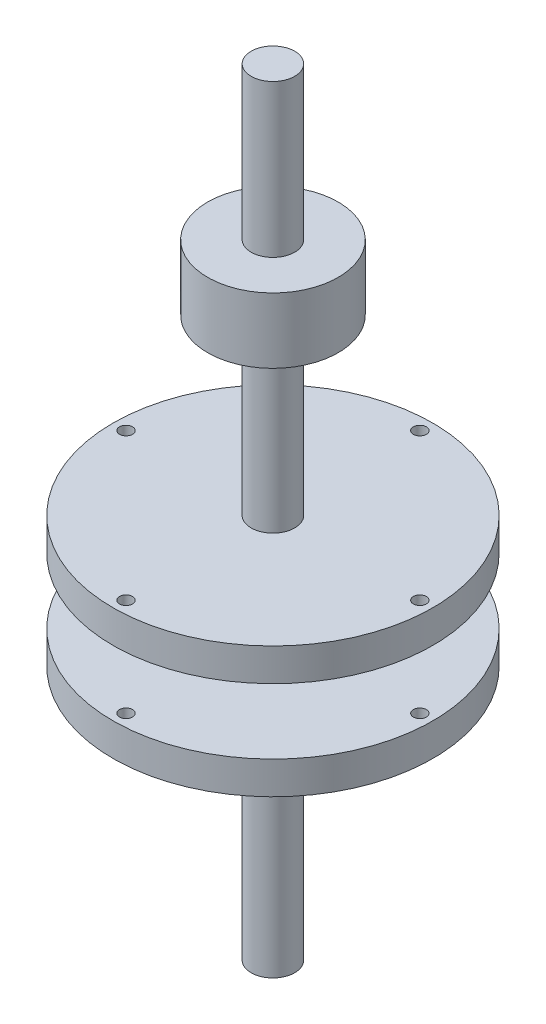
ISO-10303-21;
HEADER;
FILE_DESCRIPTION(('STEP AP214'),'2;1');
FILE_NAME('part.step','',(''),(''),'','','');
FILE_SCHEMA(('AUTOMOTIVE_DESIGN { 1 0 10303 214 1 1 1 1 }'));
ENDSEC;
DATA;
#1=APPLICATION_CONTEXT('core data for automotive mechanical design processes');
#2=APPLICATION_PROTOCOL_DEFINITION('international standard','automotive_design',2000,#1);
#3=PRODUCT_CONTEXT('',#1,'mechanical');
#4=PRODUCT('Part','Part','',(#3));
#5=PRODUCT_RELATED_PRODUCT_CATEGORY('part','',(#4));
#6=PRODUCT_DEFINITION_FORMATION('','',#4);
#7=PRODUCT_DEFINITION_CONTEXT('part definition',#1,'design');
#8=PRODUCT_DEFINITION('design','',#6,#7);
#9=PRODUCT_DEFINITION_SHAPE('','',#8);
#10=(LENGTH_UNIT() NAMED_UNIT(*) SI_UNIT(.MILLI.,.METRE.));
#11=(NAMED_UNIT(*) PLANE_ANGLE_UNIT() SI_UNIT($,.RADIAN.));
#12=(NAMED_UNIT(*) SI_UNIT($,.STERADIAN.) SOLID_ANGLE_UNIT());
#13=UNCERTAINTY_MEASURE_WITH_UNIT(LENGTH_MEASURE(1.E-05),#10,'distance_accuracy_value','');
#14=(GEOMETRIC_REPRESENTATION_CONTEXT(3) GLOBAL_UNCERTAINTY_ASSIGNED_CONTEXT((#13)) GLOBAL_UNIT_ASSIGNED_CONTEXT((#10,
#11,#12)) REPRESENTATION_CONTEXT('',''));
#15=CARTESIAN_POINT('',(0.,0.,0.));
#16=DIRECTION('',(0.,0.,1.));
#17=DIRECTION('',(1.,0.,0.));
#18=AXIS2_PLACEMENT_3D('',#15,#16,#17);
#19=CARTESIAN_POINT('',(0.,223.956756343832,0.));
#20=DIRECTION('',(0.,1.,0.));
#21=DIRECTION('',(-1.,0.,0.));
#22=AXIS2_PLACEMENT_3D('',#19,#20,#21);
#23=CYLINDRICAL_SURFACE('',#22,9.99999999999999);
#24=CARTESIAN_POINT('',(0.,-61.35475,0.));
#25=DIRECTION('',(0.,1.,0.));
#26=DIRECTION('',(-1.,0.,0.));
#27=AXIS2_PLACEMENT_3D('',#24,#25,#26);
#28=CIRCLE('',#27,9.99999999999999);
#29=CARTESIAN_POINT('',(-9.99999999999998,-61.35475,0.));
#30=VERTEX_POINT('',#29);
#31=EDGE_CURVE('E10',#30,#30,#28,.T.);
#32=ORIENTED_EDGE('',*,*,#31,.F.);
#33=EDGE_LOOP('',(#32));
#34=FACE_BOUND('',#33,.T.);
#35=CARTESIAN_POINT('',(0.,-178.35475,0.));
#36=DIRECTION('',(0.,1.,0.));
#37=DIRECTION('',(-1.,0.,0.));
#38=AXIS2_PLACEMENT_3D('',#35,#36,#37);
#39=CIRCLE('',#38,9.99999999999999);
#40=CARTESIAN_POINT('',(-9.99999999999999,-178.35475,0.));
#41=VERTEX_POINT('',#40);
#42=EDGE_CURVE('E100',#41,#41,#39,.T.);
#43=ORIENTED_EDGE('',*,*,#42,.T.);
#44=EDGE_LOOP('',(#43));
#45=FACE_BOUND('',#44,.T.);
#46=ADVANCED_FACE('F39',(#34,#45),#23,.T.);
#47=CARTESIAN_POINT('',(0.,-61.35475,0.));
#48=DIRECTION('',(0.,1.,0.));
#49=DIRECTION('',(-1.,0.,0.));
#50=AXIS2_PLACEMENT_3D('',#47,#48,#49);
#51=PLANE('',#50);
#52=CARTESIAN_POINT('',(67.5,-61.35475,0.));
#53=DIRECTION('',(0.,-1.,0.));
#54=DIRECTION('',(1.,0.,0.));
#55=AXIS2_PLACEMENT_3D('',#52,#53,#54);
#56=CIRCLE('',#55,3.00000000000001);
#57=CARTESIAN_POINT('',(70.5,-61.35475,0.));
#58=VERTEX_POINT('',#57);
#59=EDGE_CURVE('E62',#58,#58,#56,.T.);
#60=ORIENTED_EDGE('',*,*,#59,.F.);
#61=EDGE_LOOP('',(#60));
#62=FACE_BOUND('',#61,.T.);
#63=CARTESIAN_POINT('',(-67.5,-61.35475,0.));
#64=DIRECTION('',(0.,-1.,0.));
#65=DIRECTION('',(1.,0.,0.));
#66=AXIS2_PLACEMENT_3D('',#63,#64,#65);
#67=CIRCLE('',#66,3.00000000000001);
#68=CARTESIAN_POINT('',(-64.5,-61.35475,0.));
#69=VERTEX_POINT('',#68);
#70=EDGE_CURVE('E412',#69,#69,#67,.T.);
#71=ORIENTED_EDGE('',*,*,#70,.F.);
#72=EDGE_LOOP('',(#71));
#73=FACE_BOUND('',#72,.T.);
#74=CARTESIAN_POINT('',(0.,-61.35475,67.5));
#75=DIRECTION('',(0.,-1.,0.));
#76=DIRECTION('',(1.,0.,0.));
#77=AXIS2_PLACEMENT_3D('',#74,#75,#76);
#78=CIRCLE('',#77,3.);
#79=CARTESIAN_POINT('',(3.,-61.35475,67.5));
#80=VERTEX_POINT('',#79);
#81=EDGE_CURVE('E408',#80,#80,#78,.T.);
#82=ORIENTED_EDGE('',*,*,#81,.F.);
#83=EDGE_LOOP('',(#82));
#84=FACE_BOUND('',#83,.T.);
#85=CARTESIAN_POINT('',(0.,-61.35475,-67.5));
#86=DIRECTION('',(0.,-1.,0.));
#87=DIRECTION('',(1.,0.,0.));
#88=AXIS2_PLACEMENT_3D('',#85,#86,#87);
#89=CIRCLE('',#88,3.);
#90=CARTESIAN_POINT('',(3.00000000000001,-61.35475,-67.5));
#91=VERTEX_POINT('',#90);
#92=EDGE_CURVE('E404',#91,#91,#89,.T.);
#93=ORIENTED_EDGE('',*,*,#92,.F.);
#94=EDGE_LOOP('',(#93));
#95=FACE_BOUND('',#94,.T.);
#96=CARTESIAN_POINT('',(0.,-61.3547499999999,0.));
#97=DIRECTION('',(0.,1.,0.));
#98=DIRECTION('',(-1.,0.,0.));
#99=AXIS2_PLACEMENT_3D('',#96,#97,#98);
#100=CIRCLE('',#99,73.5000000000001);
#101=CARTESIAN_POINT('',(-73.5,-61.3547499999999,0.));
#102=VERTEX_POINT('',#101);
#103=EDGE_CURVE('E47',#102,#102,#100,.T.);
#104=ORIENTED_EDGE('',*,*,#103,.F.);
#105=EDGE_LOOP('',(#104));
#106=FACE_BOUND('',#105,.T.);
#107=ORIENTED_EDGE('',*,*,#31,.T.);
#108=EDGE_LOOP('',(#107));
#109=FACE_BOUND('',#108,.T.);
#110=ADVANCED_FACE('F151',(#62,#73,#84,#95,#106,#109),#51,.F.);
#111=CARTESIAN_POINT('',(0.,223.956756343832,0.));
#112=DIRECTION('',(0.,1.,0.));
#113=DIRECTION('',(-1.,0.,0.));
#114=AXIS2_PLACEMENT_3D('',#111,#112,#113);
#115=CYLINDRICAL_SURFACE('',#114,73.5);
#116=ORIENTED_EDGE('',*,*,#103,.T.);
#117=EDGE_LOOP('',(#116));
#118=FACE_BOUND('',#117,.T.);
#119=CARTESIAN_POINT('',(0.,-46.35475,0.));
#120=DIRECTION('',(0.,1.,0.));
#121=DIRECTION('',(-1.,0.,0.));
#122=AXIS2_PLACEMENT_3D('',#119,#120,#121);
#123=CIRCLE('',#122,73.5);
#124=CARTESIAN_POINT('',(-73.5,-46.35475,0.));
#125=VERTEX_POINT('',#124);
#126=EDGE_CURVE('E53',#125,#125,#123,.T.);
#127=ORIENTED_EDGE('',*,*,#126,.F.);
#128=EDGE_LOOP('',(#127));
#129=FACE_BOUND('',#128,.T.);
#130=ADVANCED_FACE('F149',(#118,#129),#115,.T.);
#131=CARTESIAN_POINT('',(0.,-46.35475,0.));
#132=DIRECTION('',(0.,-1.,0.));
#133=DIRECTION('',(1.,0.,0.));
#134=AXIS2_PLACEMENT_3D('',#131,#132,#133);
#135=PLANE('',#134);
#136=CARTESIAN_POINT('',(67.5,-46.35475,0.));
#137=DIRECTION('',(0.,-1.,0.));
#138=DIRECTION('',(1.,0.,0.));
#139=AXIS2_PLACEMENT_3D('',#136,#137,#138);
#140=CIRCLE('',#139,3.00000000000001);
#141=CARTESIAN_POINT('',(70.5,-46.35475,0.));
#142=VERTEX_POINT('',#141);
#143=EDGE_CURVE('E96',#142,#142,#140,.T.);
#144=ORIENTED_EDGE('',*,*,#143,.T.);
#145=EDGE_LOOP('',(#144));
#146=FACE_BOUND('',#145,.T.);
#147=CARTESIAN_POINT('',(-67.5,-46.35475,0.));
#148=DIRECTION('',(0.,-1.,0.));
#149=DIRECTION('',(1.,0.,0.));
#150=AXIS2_PLACEMENT_3D('',#147,#148,#149);
#151=CIRCLE('',#150,3.00000000000001);
#152=CARTESIAN_POINT('',(-64.5,-46.35475,0.));
#153=VERTEX_POINT('',#152);
#154=EDGE_CURVE('E78',#153,#153,#151,.T.);
#155=ORIENTED_EDGE('',*,*,#154,.T.);
#156=EDGE_LOOP('',(#155));
#157=FACE_BOUND('',#156,.T.);
#158=CARTESIAN_POINT('',(0.,-46.35475,67.5));
#159=DIRECTION('',(0.,-1.,0.));
#160=DIRECTION('',(1.,0.,0.));
#161=AXIS2_PLACEMENT_3D('',#158,#159,#160);
#162=CIRCLE('',#161,3.);
#163=CARTESIAN_POINT('',(3.,-46.35475,67.5));
#164=VERTEX_POINT('',#163);
#165=EDGE_CURVE('E72',#164,#164,#162,.T.);
#166=ORIENTED_EDGE('',*,*,#165,.T.);
#167=EDGE_LOOP('',(#166));
#168=FACE_BOUND('',#167,.T.);
#169=CARTESIAN_POINT('',(0.,-46.35475,-67.5));
#170=DIRECTION('',(0.,-1.,0.));
#171=DIRECTION('',(1.,0.,0.));
#172=AXIS2_PLACEMENT_3D('',#169,#170,#171);
#173=CIRCLE('',#172,3.);
#174=CARTESIAN_POINT('',(3.00000000000001,-46.35475,-67.5));
#175=VERTEX_POINT('',#174);
#176=EDGE_CURVE('E67',#175,#175,#173,.T.);
#177=ORIENTED_EDGE('',*,*,#176,.T.);
#178=EDGE_LOOP('',(#177));
#179=FACE_BOUND('',#178,.T.);
#180=CARTESIAN_POINT('',(0.,-46.35475,0.));
#181=DIRECTION('',(0.,1.,0.));
#182=DIRECTION('',(-1.,0.,0.));
#183=AXIS2_PLACEMENT_3D('',#180,#181,#182);
#184=CIRCLE('',#183,9.99999999999999);
#185=CARTESIAN_POINT('',(-9.99999999999998,-46.35475,0.));
#186=VERTEX_POINT('',#185);
#187=EDGE_CURVE('E140',#186,#186,#184,.T.);
#188=ORIENTED_EDGE('',*,*,#187,.F.);
#189=EDGE_LOOP('',(#188));
#190=FACE_BOUND('',#189,.T.);
#191=ORIENTED_EDGE('',*,*,#126,.T.);
#192=EDGE_LOOP('',(#191));
#193=FACE_BOUND('',#192,.T.);
#194=ADVANCED_FACE('F147',(#146,#157,#168,#179,#190,#193),#135,.F.);
#195=CARTESIAN_POINT('',(0.,223.956756343832,0.));
#196=DIRECTION('',(0.,1.,0.));
#197=DIRECTION('',(-1.,0.,0.));
#198=AXIS2_PLACEMENT_3D('',#195,#196,#197);
#199=CYLINDRICAL_SURFACE('',#198,9.99999999999999);
#200=CARTESIAN_POINT('',(0.,-16.35475,0.));
#201=DIRECTION('',(0.,1.,0.));
#202=DIRECTION('',(-1.,0.,0.));
#203=AXIS2_PLACEMENT_3D('',#200,#201,#202);
#204=CIRCLE('',#203,9.99999999999999);
#205=CARTESIAN_POINT('',(-9.99999999999998,-16.35475,0.));
#206=VERTEX_POINT('',#205);
#207=EDGE_CURVE('E136',#206,#206,#204,.T.);
#208=ORIENTED_EDGE('',*,*,#207,.F.);
#209=EDGE_LOOP('',(#208));
#210=FACE_BOUND('',#209,.T.);
#211=ORIENTED_EDGE('',*,*,#187,.T.);
#212=EDGE_LOOP('',(#211));
#213=FACE_BOUND('',#212,.T.);
#214=ADVANCED_FACE('F158',(#210,#213),#199,.T.);
#215=CARTESIAN_POINT('',(0.,-16.35475,0.));
#216=DIRECTION('',(0.,-1.,0.));
#217=DIRECTION('',(1.,0.,0.));
#218=AXIS2_PLACEMENT_3D('',#215,#216,#217);
#219=PLANE('',#218);
#220=CARTESIAN_POINT('',(67.5,-16.35475,0.));
#221=DIRECTION('',(0.,-1.,0.));
#222=DIRECTION('',(1.,0.,0.));
#223=AXIS2_PLACEMENT_3D('',#220,#221,#222);
#224=CIRCLE('',#223,3.00000000000001);
#225=CARTESIAN_POINT('',(70.5,-16.35475,0.));
#226=VERTEX_POINT('',#225);
#227=EDGE_CURVE('E92',#226,#226,#224,.T.);
#228=ORIENTED_EDGE('',*,*,#227,.F.);
#229=EDGE_LOOP('',(#228));
#230=FACE_BOUND('',#229,.T.);
#231=CARTESIAN_POINT('',(-67.5,-16.35475,0.));
#232=DIRECTION('',(0.,-1.,0.));
#233=DIRECTION('',(1.,0.,0.));
#234=AXIS2_PLACEMENT_3D('',#231,#232,#233);
#235=CIRCLE('',#234,3.00000000000001);
#236=CARTESIAN_POINT('',(-64.5,-16.35475,0.));
#237=VERTEX_POINT('',#236);
#238=EDGE_CURVE('E71',#237,#237,#235,.T.);
#239=ORIENTED_EDGE('',*,*,#238,.F.);
#240=EDGE_LOOP('',(#239));
#241=FACE_BOUND('',#240,.T.);
#242=CARTESIAN_POINT('',(0.,-16.35475,67.5));
#243=DIRECTION('',(0.,-1.,0.));
#244=DIRECTION('',(1.,0.,0.));
#245=AXIS2_PLACEMENT_3D('',#242,#243,#244);
#246=CIRCLE('',#245,3.);
#247=CARTESIAN_POINT('',(3.,-16.35475,67.5));
#248=VERTEX_POINT('',#247);
#249=EDGE_CURVE('E66',#248,#248,#246,.T.);
#250=ORIENTED_EDGE('',*,*,#249,.F.);
#251=EDGE_LOOP('',(#250));
#252=FACE_BOUND('',#251,.T.);
#253=CARTESIAN_POINT('',(0.,-16.35475,-67.5));
#254=DIRECTION('',(0.,-1.,0.));
#255=DIRECTION('',(1.,0.,0.));
#256=AXIS2_PLACEMENT_3D('',#253,#254,#255);
#257=CIRCLE('',#256,3.);
#258=CARTESIAN_POINT('',(3.00000000000001,-16.35475,-67.5));
#259=VERTEX_POINT('',#258);
#260=EDGE_CURVE('E61',#259,#259,#257,.T.);
#261=ORIENTED_EDGE('',*,*,#260,.F.);
#262=EDGE_LOOP('',(#261));
#263=FACE_BOUND('',#262,.T.);
#264=ORIENTED_EDGE('',*,*,#207,.T.);
#265=EDGE_LOOP('',(#264));
#266=FACE_BOUND('',#265,.T.);
#267=CARTESIAN_POINT('',(0.,-16.3547499999999,0.));
#268=DIRECTION('',(0.,1.,0.));
#269=DIRECTION('',(-1.,0.,0.));
#270=AXIS2_PLACEMENT_3D('',#267,#268,#269);
#271=CIRCLE('',#270,73.5);
#272=CARTESIAN_POINT('',(-73.5,-16.3547499999999,0.));
#273=VERTEX_POINT('',#272);
#274=EDGE_CURVE('E132',#273,#273,#271,.T.);
#275=ORIENTED_EDGE('',*,*,#274,.F.);
#276=EDGE_LOOP('',(#275));
#277=FACE_BOUND('',#276,.T.);
#278=ADVANCED_FACE('F213',(#230,#241,#252,#263,#266,#277),#219,.T.);
#279=CARTESIAN_POINT('',(0.,223.956756343832,0.));
#280=DIRECTION('',(0.,1.,0.));
#281=DIRECTION('',(-1.,0.,0.));
#282=AXIS2_PLACEMENT_3D('',#279,#280,#281);
#283=CYLINDRICAL_SURFACE('',#282,73.5);
#284=ORIENTED_EDGE('',*,*,#274,.T.);
#285=EDGE_LOOP('',(#284));
#286=FACE_BOUND('',#285,.T.);
#287=CARTESIAN_POINT('',(0.,-1.35474999999996,0.));
#288=DIRECTION('',(0.,1.,0.));
#289=DIRECTION('',(-1.,0.,0.));
#290=AXIS2_PLACEMENT_3D('',#287,#288,#289);
#291=CIRCLE('',#290,73.5);
#292=CARTESIAN_POINT('',(-73.5,-1.35474999999996,0.));
#293=VERTEX_POINT('',#292);
#294=EDGE_CURVE('E128',#293,#293,#291,.T.);
#295=ORIENTED_EDGE('',*,*,#294,.F.);
#296=EDGE_LOOP('',(#295));
#297=FACE_BOUND('',#296,.T.);
#298=ADVANCED_FACE('F209',(#286,#297),#283,.T.);
#299=CARTESIAN_POINT('',(0.,-1.35474999999997,0.));
#300=DIRECTION('',(0.,1.,0.));
#301=DIRECTION('',(-1.,0.,0.));
#302=AXIS2_PLACEMENT_3D('',#299,#300,#301);
#303=PLANE('',#302);
#304=CARTESIAN_POINT('',(67.5,-1.35474999999997,0.));
#305=DIRECTION('',(0.,1.,0.));
#306=DIRECTION('',(-1.,0.,0.));
#307=AXIS2_PLACEMENT_3D('',#304,#305,#306);
#308=CIRCLE('',#307,3.00000000000001);
#309=CARTESIAN_POINT('',(64.5,-1.35474999999997,0.));
#310=VERTEX_POINT('',#309);
#311=EDGE_CURVE('E42',#310,#310,#308,.T.);
#312=ORIENTED_EDGE('',*,*,#311,.F.);
#313=EDGE_LOOP('',(#312));
#314=FACE_BOUND('',#313,.T.);
#315=CARTESIAN_POINT('',(-67.5,-1.35474999999996,0.));
#316=DIRECTION('',(0.,1.,0.));
#317=DIRECTION('',(-1.,0.,0.));
#318=AXIS2_PLACEMENT_3D('',#315,#316,#317);
#319=CIRCLE('',#318,3.00000000000001);
#320=CARTESIAN_POINT('',(-70.5,-1.35474999999996,0.));
#321=VERTEX_POINT('',#320);
#322=EDGE_CURVE('E68',#321,#321,#319,.T.);
#323=ORIENTED_EDGE('',*,*,#322,.F.);
#324=EDGE_LOOP('',(#323));
#325=FACE_BOUND('',#324,.T.);
#326=CARTESIAN_POINT('',(0.,-1.35474999999997,67.5));
#327=DIRECTION('',(0.,1.,0.));
#328=DIRECTION('',(-1.,0.,0.));
#329=AXIS2_PLACEMENT_3D('',#326,#327,#328);
#330=CIRCLE('',#329,3.);
#331=CARTESIAN_POINT('',(-3.,-1.35474999999997,67.5));
#332=VERTEX_POINT('',#331);
#333=EDGE_CURVE('E63',#332,#332,#330,.T.);
#334=ORIENTED_EDGE('',*,*,#333,.F.);
#335=EDGE_LOOP('',(#334));
#336=FACE_BOUND('',#335,.T.);
#337=CARTESIAN_POINT('',(0.,-1.35474999999997,-67.5));
#338=DIRECTION('',(0.,1.,0.));
#339=DIRECTION('',(-1.,0.,0.));
#340=AXIS2_PLACEMENT_3D('',#337,#338,#339);
#341=CIRCLE('',#340,3.);
#342=CARTESIAN_POINT('',(-2.99999999999999,-1.35474999999997,-67.5));
#343=VERTEX_POINT('',#342);
#344=EDGE_CURVE('E57',#343,#343,#341,.T.);
#345=ORIENTED_EDGE('',*,*,#344,.F.);
#346=EDGE_LOOP('',(#345));
#347=FACE_BOUND('',#346,.T.);
#348=ORIENTED_EDGE('',*,*,#294,.T.);
#349=EDGE_LOOP('',(#348));
#350=FACE_BOUND('',#349,.T.);
#351=CARTESIAN_POINT('',(0.,-1.35474999999999,0.));
#352=DIRECTION('',(0.,1.,0.));
#353=DIRECTION('',(-1.,0.,0.));
#354=AXIS2_PLACEMENT_3D('',#351,#352,#353);
#355=CIRCLE('',#354,9.99999999999999);
#356=CARTESIAN_POINT('',(-9.99999999999998,-1.35474999999999,0.));
#357=VERTEX_POINT('',#356);
#358=EDGE_CURVE('E124',#357,#357,#355,.T.);
#359=ORIENTED_EDGE('',*,*,#358,.F.);
#360=EDGE_LOOP('',(#359));
#361=FACE_BOUND('',#360,.T.);
#362=ADVANCED_FACE('F205',(#314,#325,#336,#347,#350,#361),#303,.T.);
#363=CARTESIAN_POINT('',(0.,223.956756343832,0.));
#364=DIRECTION('',(0.,1.,0.));
#365=DIRECTION('',(-1.,0.,0.));
#366=AXIS2_PLACEMENT_3D('',#363,#364,#365);
#367=CYLINDRICAL_SURFACE('',#366,9.99999999999998);
#368=CARTESIAN_POINT('',(0.,78.35475,0.));
#369=DIRECTION('',(0.,1.,0.));
#370=DIRECTION('',(-1.,0.,0.));
#371=AXIS2_PLACEMENT_3D('',#368,#369,#370);
#372=CIRCLE('',#371,9.99999999999998);
#373=CARTESIAN_POINT('',(-9.99999999999997,78.35475,0.));
#374=VERTEX_POINT('',#373);
#375=EDGE_CURVE('E120',#374,#374,#372,.T.);
#376=ORIENTED_EDGE('',*,*,#375,.F.);
#377=EDGE_LOOP('',(#376));
#378=FACE_BOUND('',#377,.T.);
#379=ORIENTED_EDGE('',*,*,#358,.T.);
#380=EDGE_LOOP('',(#379));
#381=FACE_BOUND('',#380,.T.);
#382=ADVANCED_FACE('F201',(#378,#381),#367,.T.);
#383=CARTESIAN_POINT('',(0.,78.35475,0.));
#384=DIRECTION('',(0.,1.,0.));
#385=DIRECTION('',(-1.,0.,0.));
#386=AXIS2_PLACEMENT_3D('',#383,#384,#385);
#387=PLANE('',#386);
#388=CARTESIAN_POINT('',(0.,78.35475,0.));
#389=DIRECTION('',(0.,1.,0.));
#390=DIRECTION('',(-1.,0.,0.));
#391=AXIS2_PLACEMENT_3D('',#388,#389,#390);
#392=CIRCLE('',#391,30.);
#393=CARTESIAN_POINT('',(-30.,78.35475,0.));
#394=VERTEX_POINT('',#393);
#395=EDGE_CURVE('E116',#394,#394,#392,.T.);
#396=ORIENTED_EDGE('',*,*,#395,.F.);
#397=EDGE_LOOP('',(#396));
#398=FACE_BOUND('',#397,.T.);
#399=ORIENTED_EDGE('',*,*,#375,.T.);
#400=EDGE_LOOP('',(#399));
#401=FACE_BOUND('',#400,.T.);
#402=ADVANCED_FACE('F197',(#398,#401),#387,.F.);
#403=CARTESIAN_POINT('',(0.,223.956756343832,0.));
#404=DIRECTION('',(0.,1.,0.));
#405=DIRECTION('',(-1.,0.,0.));
#406=AXIS2_PLACEMENT_3D('',#403,#404,#405);
#407=CYLINDRICAL_SURFACE('',#406,30.);
#408=ORIENTED_EDGE('',*,*,#395,.T.);
#409=EDGE_LOOP('',(#408));
#410=FACE_BOUND('',#409,.T.);
#411=CARTESIAN_POINT('',(0.,108.35475,0.));
#412=DIRECTION('',(0.,1.,0.));
#413=DIRECTION('',(-1.,0.,0.));
#414=AXIS2_PLACEMENT_3D('',#411,#412,#413);
#415=CIRCLE('',#414,30.);
#416=CARTESIAN_POINT('',(-30.,108.35475,0.));
#417=VERTEX_POINT('',#416);
#418=EDGE_CURVE('E112',#417,#417,#415,.T.);
#419=ORIENTED_EDGE('',*,*,#418,.F.);
#420=EDGE_LOOP('',(#419));
#421=FACE_BOUND('',#420,.T.);
#422=ADVANCED_FACE('F193',(#410,#421),#407,.T.);
#423=CARTESIAN_POINT('',(0.,108.35475,0.));
#424=DIRECTION('',(0.,1.,0.));
#425=DIRECTION('',(-1.,0.,0.));
#426=AXIS2_PLACEMENT_3D('',#423,#424,#425);
#427=PLANE('',#426);
#428=ORIENTED_EDGE('',*,*,#418,.T.);
#429=EDGE_LOOP('',(#428));
#430=FACE_BOUND('',#429,.T.);
#431=CARTESIAN_POINT('',(0.,108.35475,0.));
#432=DIRECTION('',(0.,1.,0.));
#433=DIRECTION('',(-1.,0.,0.));
#434=AXIS2_PLACEMENT_3D('',#431,#432,#433);
#435=CIRCLE('',#434,9.99999999999998);
#436=CARTESIAN_POINT('',(-9.99999999999997,108.35475,0.));
#437=VERTEX_POINT('',#436);
#438=EDGE_CURVE('E108',#437,#437,#435,.T.);
#439=ORIENTED_EDGE('',*,*,#438,.F.);
#440=EDGE_LOOP('',(#439));
#441=FACE_BOUND('',#440,.T.);
#442=ADVANCED_FACE('F189',(#430,#441),#427,.T.);
#443=CARTESIAN_POINT('',(0.,223.956756343832,0.));
#444=DIRECTION('',(0.,1.,0.));
#445=DIRECTION('',(-1.,0.,0.));
#446=AXIS2_PLACEMENT_3D('',#443,#444,#445);
#447=CYLINDRICAL_SURFACE('',#446,9.99999999999998);
#448=CARTESIAN_POINT('',(0.,178.35475,0.));
#449=DIRECTION('',(0.,1.,0.));
#450=DIRECTION('',(-1.,0.,0.));
#451=AXIS2_PLACEMENT_3D('',#448,#449,#450);
#452=CIRCLE('',#451,9.99999999999998);
#453=CARTESIAN_POINT('',(-9.99999999999996,178.35475,0.));
#454=VERTEX_POINT('',#453);
#455=EDGE_CURVE('E104',#454,#454,#452,.T.);
#456=ORIENTED_EDGE('',*,*,#455,.F.);
#457=EDGE_LOOP('',(#456));
#458=FACE_BOUND('',#457,.T.);
#459=ORIENTED_EDGE('',*,*,#438,.T.);
#460=EDGE_LOOP('',(#459));
#461=FACE_BOUND('',#460,.T.);
#462=ADVANCED_FACE('F182',(#458,#461),#447,.T.);
#463=CARTESIAN_POINT('',(0.,178.35475,0.));
#464=DIRECTION('',(0.,1.,0.));
#465=DIRECTION('',(-1.,0.,0.));
#466=AXIS2_PLACEMENT_3D('',#463,#464,#465);
#467=PLANE('',#466);
#468=ORIENTED_EDGE('',*,*,#455,.T.);
#469=EDGE_LOOP('',(#468));
#470=FACE_BOUND('',#469,.T.);
#471=ADVANCED_FACE('F172',(#470),#467,.T.);
#472=CARTESIAN_POINT('',(0.,-178.35475,0.));
#473=DIRECTION('',(0.,1.,0.));
#474=DIRECTION('',(-1.,0.,0.));
#475=AXIS2_PLACEMENT_3D('',#472,#473,#474);
#476=PLANE('',#475);
#477=ORIENTED_EDGE('',*,*,#42,.F.);
#478=EDGE_LOOP('',(#477));
#479=FACE_BOUND('',#478,.T.);
#480=ADVANCED_FACE('F169',(#479),#476,.F.);
#481=CARTESIAN_POINT('',(0.,18.64525,-67.5));
#482=DIRECTION('',(0.,-1.,0.));
#483=DIRECTION('',(1.,0.,0.));
#484=AXIS2_PLACEMENT_3D('',#481,#482,#483);
#485=CYLINDRICAL_SURFACE('',#484,3.);
#486=ORIENTED_EDGE('',*,*,#260,.T.);
#487=EDGE_LOOP('',(#486));
#488=FACE_BOUND('',#487,.T.);
#489=ORIENTED_EDGE('',*,*,#344,.T.);
#490=EDGE_LOOP('',(#489));
#491=FACE_BOUND('',#490,.T.);
#492=ADVANCED_FACE('F171',(#488,#491),#485,.F.);
#493=CARTESIAN_POINT('',(0.,18.64525,67.5));
#494=DIRECTION('',(0.,-1.,0.));
#495=DIRECTION('',(1.,0.,0.));
#496=AXIS2_PLACEMENT_3D('',#493,#494,#495);
#497=CYLINDRICAL_SURFACE('',#496,3.);
#498=ORIENTED_EDGE('',*,*,#249,.T.);
#499=EDGE_LOOP('',(#498));
#500=FACE_BOUND('',#499,.T.);
#501=ORIENTED_EDGE('',*,*,#333,.T.);
#502=EDGE_LOOP('',(#501));
#503=FACE_BOUND('',#502,.T.);
#504=ADVANCED_FACE('F178',(#500,#503),#497,.F.);
#505=CARTESIAN_POINT('',(-67.5,18.64525,0.));
#506=DIRECTION('',(0.,-1.,0.));
#507=DIRECTION('',(1.,0.,0.));
#508=AXIS2_PLACEMENT_3D('',#505,#506,#507);
#509=CYLINDRICAL_SURFACE('',#508,3.00000000000001);
#510=ORIENTED_EDGE('',*,*,#238,.T.);
#511=EDGE_LOOP('',(#510));
#512=FACE_BOUND('',#511,.T.);
#513=ORIENTED_EDGE('',*,*,#322,.T.);
#514=EDGE_LOOP('',(#513));
#515=FACE_BOUND('',#514,.T.);
#516=ADVANCED_FACE('F331',(#512,#515),#509,.F.);
#517=CARTESIAN_POINT('',(67.5,18.64525,0.));
#518=DIRECTION('',(0.,-1.,0.));
#519=DIRECTION('',(1.,0.,0.));
#520=AXIS2_PLACEMENT_3D('',#517,#518,#519);
#521=CYLINDRICAL_SURFACE('',#520,3.00000000000001);
#522=ORIENTED_EDGE('',*,*,#227,.T.);
#523=EDGE_LOOP('',(#522));
#524=FACE_BOUND('',#523,.T.);
#525=ORIENTED_EDGE('',*,*,#311,.T.);
#526=EDGE_LOOP('',(#525));
#527=FACE_BOUND('',#526,.T.);
#528=ADVANCED_FACE('F340',(#524,#527),#521,.F.);
#529=ORIENTED_EDGE('',*,*,#92,.T.);
#530=EDGE_LOOP('',(#529));
#531=FACE_BOUND('',#530,.T.);
#532=ORIENTED_EDGE('',*,*,#176,.F.);
#533=EDGE_LOOP('',(#532));
#534=FACE_BOUND('',#533,.T.);
#535=ADVANCED_FACE('F181',(#531,#534),#485,.F.);
#536=ORIENTED_EDGE('',*,*,#81,.T.);
#537=EDGE_LOOP('',(#536));
#538=FACE_BOUND('',#537,.T.);
#539=ORIENTED_EDGE('',*,*,#165,.F.);
#540=EDGE_LOOP('',(#539));
#541=FACE_BOUND('',#540,.T.);
#542=ADVANCED_FACE('F333',(#538,#541),#497,.F.);
#543=ORIENTED_EDGE('',*,*,#70,.T.);
#544=EDGE_LOOP('',(#543));
#545=FACE_BOUND('',#544,.T.);
#546=ORIENTED_EDGE('',*,*,#154,.F.);
#547=EDGE_LOOP('',(#546));
#548=FACE_BOUND('',#547,.T.);
#549=ADVANCED_FACE('F343',(#545,#548),#509,.F.);
#550=ORIENTED_EDGE('',*,*,#59,.T.);
#551=EDGE_LOOP('',(#550));
#552=FACE_BOUND('',#551,.T.);
#553=ORIENTED_EDGE('',*,*,#143,.F.);
#554=EDGE_LOOP('',(#553));
#555=FACE_BOUND('',#554,.T.);
#556=ADVANCED_FACE('F352',(#552,#555),#521,.F.);
#557=CLOSED_SHELL('',(#46,#110,#130,#194,#214,#278,#298,#362,#382,#402,#422,#442,#462,#471,#480,
#492,#504,#516,#528,#535,#542,#549,#556));
#558=MANIFOLD_SOLID_BREP('B2',#557);
#559=ADVANCED_BREP_SHAPE_REPRESENTATION('',(#18,#558),#14);
#560=SHAPE_DEFINITION_REPRESENTATION(#9,#559);
ENDSEC;
END-ISO-10303-21;
